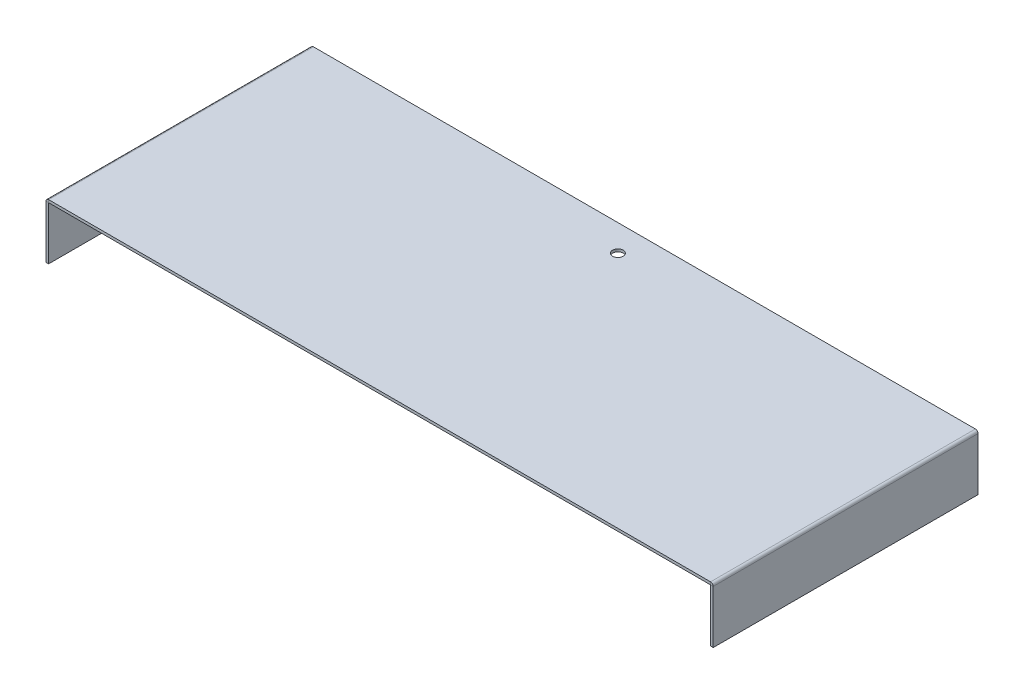
ISO-10303-21;
HEADER;
FILE_DESCRIPTION(('STEP AP214'),'2;1');
FILE_NAME('part.step','',(''),(''),'','','');
FILE_SCHEMA(('AUTOMOTIVE_DESIGN { 1 0 10303 214 1 1 1 1 }'));
ENDSEC;
DATA;
#1=APPLICATION_CONTEXT('core data for automotive mechanical design processes');
#2=APPLICATION_PROTOCOL_DEFINITION('international standard','automotive_design',2000,#1);
#3=PRODUCT_CONTEXT('',#1,'mechanical');
#4=PRODUCT('Part','Part','',(#3));
#5=PRODUCT_RELATED_PRODUCT_CATEGORY('part','',(#4));
#6=PRODUCT_DEFINITION_FORMATION('','',#4);
#7=PRODUCT_DEFINITION_CONTEXT('part definition',#1,'design');
#8=PRODUCT_DEFINITION('design','',#6,#7);
#9=PRODUCT_DEFINITION_SHAPE('','',#8);
#10=(LENGTH_UNIT() NAMED_UNIT(*) SI_UNIT(.MILLI.,.METRE.));
#11=(NAMED_UNIT(*) PLANE_ANGLE_UNIT() SI_UNIT($,.RADIAN.));
#12=(NAMED_UNIT(*) SI_UNIT($,.STERADIAN.) SOLID_ANGLE_UNIT());
#13=UNCERTAINTY_MEASURE_WITH_UNIT(LENGTH_MEASURE(1.E-05),#10,'distance_accuracy_value','');
#14=(GEOMETRIC_REPRESENTATION_CONTEXT(3) GLOBAL_UNCERTAINTY_ASSIGNED_CONTEXT((#13)) GLOBAL_UNIT_ASSIGNED_CONTEXT((#10,
#11,#12)) REPRESENTATION_CONTEXT('',''));
#15=CARTESIAN_POINT('',(0.,0.,0.));
#16=DIRECTION('',(0.,0.,1.));
#17=DIRECTION('',(1.,0.,0.));
#18=AXIS2_PLACEMENT_3D('',#15,#16,#17);
#19=CARTESIAN_POINT('',(-125.,-1.83880688453542E-13,0.));
#20=DIRECTION('',(0.,0.,-1.));
#21=DIRECTION('',(-1.,0.,0.));
#22=AXIS2_PLACEMENT_3D('',#19,#20,#21);
#23=PLANE('',#22);
#24=DIRECTION('',(-1.,0.,0.));
#25=VECTOR('',#24,1.);
#26=CARTESIAN_POINT('',(-125.,-1.83880688453542E-13,0.));
#27=LINE('',#26,#25);
#28=CARTESIAN_POINT('',(-125.,-1.83880688453542E-13,0.));
#29=VERTEX_POINT('',#28);
#30=CARTESIAN_POINT('',(-126.,-1.83880688453542E-13,0.));
#31=VERTEX_POINT('',#30);
#32=EDGE_CURVE('E11',#29,#31,#27,.T.);
#33=ORIENTED_EDGE('',*,*,#32,.F.);
#34=DIRECTION('',(0.,-1.,0.));
#35=VECTOR('',#34,1.);
#36=CARTESIAN_POINT('',(-125.,-1.83880688453542E-13,0.));
#37=LINE('',#36,#35);
#38=CARTESIAN_POINT('',(-125.,-20.,0.));
#39=VERTEX_POINT('',#38);
#40=EDGE_CURVE('E160',#29,#39,#37,.T.);
#41=ORIENTED_EDGE('',*,*,#40,.T.);
#42=DIRECTION('',(-1.,0.,0.));
#43=VECTOR('',#42,1.);
#44=CARTESIAN_POINT('',(-125.,-20.,0.));
#45=LINE('',#44,#43);
#46=CARTESIAN_POINT('',(-126.,-20.,0.));
#47=VERTEX_POINT('',#46);
#48=EDGE_CURVE('E157',#39,#47,#45,.T.);
#49=ORIENTED_EDGE('',*,*,#48,.T.);
#50=DIRECTION('',(0.,1.,0.));
#51=VECTOR('',#50,1.);
#52=CARTESIAN_POINT('',(-126.,-1.83880688453542E-13,0.));
#53=LINE('',#52,#51);
#54=EDGE_CURVE('E127',#31,#47,#53,.F.);
#55=ORIENTED_EDGE('',*,*,#54,.F.);
#56=EDGE_LOOP('',(#33,#41,#49,#55));
#57=FACE_BOUND('',#56,.T.);
#58=ADVANCED_FACE('F36',(#57),#23,.T.);
#59=CARTESIAN_POINT('',(-125.,-1.83880688453542E-13,0.));
#60=DIRECTION('',(0.,0.,-1.));
#61=DIRECTION('',(-1.,0.,0.));
#62=AXIS2_PLACEMENT_3D('',#59,#60,#61);
#63=PLANE('',#62);
#64=DIRECTION('',(0.,1.,0.));
#65=VECTOR('',#64,1.);
#66=CARTESIAN_POINT('',(-125.,-1.83880688453542E-13,0.));
#67=LINE('',#66,#65);
#68=CARTESIAN_POINT('',(-125.,0.999999999999816,0.));
#69=VERTEX_POINT('',#68);
#70=EDGE_CURVE('E43',#29,#69,#67,.T.);
#71=ORIENTED_EDGE('',*,*,#70,.F.);
#72=ORIENTED_EDGE('',*,*,#32,.T.);
#73=CARTESIAN_POINT('',(-125.,-1.83880688453542E-13,0.));
#74=DIRECTION('',(0.,0.,1.));
#75=DIRECTION('',(1.,0.,0.));
#76=AXIS2_PLACEMENT_3D('',#73,#74,#75);
#77=CIRCLE('',#76,1.);
#78=EDGE_CURVE('E192',#31,#69,#77,.F.);
#79=ORIENTED_EDGE('',*,*,#78,.T.);
#80=EDGE_LOOP('',(#71,#72,#79));
#81=FACE_BOUND('',#80,.T.);
#82=ADVANCED_FACE('F222',(#81),#63,.T.);
#83=CARTESIAN_POINT('',(-125.,-1.83880688453542E-13,100.));
#84=DIRECTION('',(0.,0.,1.));
#85=DIRECTION('',(1.,0.,0.));
#86=AXIS2_PLACEMENT_3D('',#83,#84,#85);
#87=PLANE('',#86);
#88=DIRECTION('',(0.,1.,0.));
#89=VECTOR('',#88,1.);
#90=CARTESIAN_POINT('',(-125.,-1.83880688453542E-13,100.));
#91=LINE('',#90,#89);
#92=CARTESIAN_POINT('',(-125.,-1.83880688453542E-13,100.));
#93=VERTEX_POINT('',#92);
#94=CARTESIAN_POINT('',(-125.,0.999999999999816,100.));
#95=VERTEX_POINT('',#94);
#96=EDGE_CURVE('E214',#93,#95,#91,.T.);
#97=ORIENTED_EDGE('',*,*,#96,.F.);
#98=DIRECTION('',(-1.,0.,0.));
#99=VECTOR('',#98,1.);
#100=CARTESIAN_POINT('',(-125.,-1.83880688453542E-13,100.));
#101=LINE('',#100,#99);
#102=CARTESIAN_POINT('',(125.,0.,100.));
#103=VERTEX_POINT('',#102);
#104=EDGE_CURVE('E137',#103,#93,#101,.T.);
#105=ORIENTED_EDGE('',*,*,#104,.F.);
#106=DIRECTION('',(0.,1.,0.));
#107=VECTOR('',#106,1.);
#108=CARTESIAN_POINT('',(125.,0.,100.));
#109=LINE('',#108,#107);
#110=CARTESIAN_POINT('',(125.,1.,100.));
#111=VERTEX_POINT('',#110);
#112=EDGE_CURVE('E206',#103,#111,#109,.T.);
#113=ORIENTED_EDGE('',*,*,#112,.T.);
#114=DIRECTION('',(-1.,0.,0.));
#115=VECTOR('',#114,1.);
#116=CARTESIAN_POINT('',(-125.,0.999999999999816,100.));
#117=LINE('',#116,#115);
#118=EDGE_CURVE('E152',#111,#95,#117,.T.);
#119=ORIENTED_EDGE('',*,*,#118,.T.);
#120=EDGE_LOOP('',(#97,#105,#113,#119));
#121=FACE_BOUND('',#120,.T.);
#122=ADVANCED_FACE('F236',(#121),#87,.T.);
#123=CARTESIAN_POINT('',(-125.,-1.83880688453542E-13,100.));
#124=DIRECTION('',(0.,0.,1.));
#125=DIRECTION('',(1.,0.,0.));
#126=AXIS2_PLACEMENT_3D('',#123,#124,#125);
#127=PLANE('',#126);
#128=DIRECTION('',(-1.,0.,0.));
#129=VECTOR('',#128,1.);
#130=CARTESIAN_POINT('',(-125.,-1.83880688453542E-13,100.));
#131=LINE('',#130,#129);
#132=CARTESIAN_POINT('',(-126.,-1.83880688453542E-13,100.));
#133=VERTEX_POINT('',#132);
#134=EDGE_CURVE('E50',#93,#133,#131,.T.);
#135=ORIENTED_EDGE('',*,*,#134,.F.);
#136=ORIENTED_EDGE('',*,*,#96,.T.);
#137=CARTESIAN_POINT('',(-125.,-1.83880688453542E-13,100.));
#138=DIRECTION('',(0.,0.,1.));
#139=DIRECTION('',(1.,0.,0.));
#140=AXIS2_PLACEMENT_3D('',#137,#138,#139);
#141=CIRCLE('',#140,1.);
#142=EDGE_CURVE('E200',#95,#133,#141,.T.);
#143=ORIENTED_EDGE('',*,*,#142,.T.);
#144=EDGE_LOOP('',(#135,#136,#143));
#145=FACE_BOUND('',#144,.T.);
#146=ADVANCED_FACE('F232',(#145),#127,.T.);
#147=CARTESIAN_POINT('',(125.,0.,0.));
#148=DIRECTION('',(0.,0.,-1.));
#149=DIRECTION('',(-1.,0.,0.));
#150=AXIS2_PLACEMENT_3D('',#147,#148,#149);
#151=PLANE('',#150);
#152=DIRECTION('',(0.,1.,0.));
#153=VECTOR('',#152,1.);
#154=CARTESIAN_POINT('',(125.,0.,0.));
#155=LINE('',#154,#153);
#156=CARTESIAN_POINT('',(125.,0.,0.));
#157=VERTEX_POINT('',#156);
#158=CARTESIAN_POINT('',(125.,1.,0.));
#159=VERTEX_POINT('',#158);
#160=EDGE_CURVE('E211',#157,#159,#155,.T.);
#161=ORIENTED_EDGE('',*,*,#160,.F.);
#162=DIRECTION('',(-1.,0.,0.));
#163=VECTOR('',#162,1.);
#164=CARTESIAN_POINT('',(-125.,-1.83880688453542E-13,0.));
#165=LINE('',#164,#163);
#166=EDGE_CURVE('E163',#157,#29,#165,.T.);
#167=ORIENTED_EDGE('',*,*,#166,.T.);
#168=ORIENTED_EDGE('',*,*,#70,.T.);
#169=DIRECTION('',(-1.,0.,0.));
#170=VECTOR('',#169,1.);
#171=CARTESIAN_POINT('',(-125.,0.999999999999816,0.));
#172=LINE('',#171,#170);
#173=EDGE_CURVE('E121',#159,#69,#172,.T.);
#174=ORIENTED_EDGE('',*,*,#173,.F.);
#175=EDGE_LOOP('',(#161,#167,#168,#174));
#176=FACE_BOUND('',#175,.T.);
#177=ADVANCED_FACE('F218',(#176),#151,.T.);
#178=CARTESIAN_POINT('',(125.,0.,0.));
#179=DIRECTION('',(0.,0.,-1.));
#180=DIRECTION('',(-1.,0.,0.));
#181=AXIS2_PLACEMENT_3D('',#178,#179,#180);
#182=PLANE('',#181);
#183=DIRECTION('',(1.,0.,0.));
#184=VECTOR('',#183,1.);
#185=CARTESIAN_POINT('',(125.,0.,0.));
#186=LINE('',#185,#184);
#187=CARTESIAN_POINT('',(126.,0.,0.));
#188=VERTEX_POINT('',#187);
#189=EDGE_CURVE('E209',#157,#188,#186,.T.);
#190=ORIENTED_EDGE('',*,*,#189,.F.);
#191=ORIENTED_EDGE('',*,*,#160,.T.);
#192=CARTESIAN_POINT('',(125.,0.,0.));
#193=DIRECTION('',(0.,0.,1.));
#194=DIRECTION('',(1.,0.,0.));
#195=AXIS2_PLACEMENT_3D('',#192,#193,#194);
#196=CIRCLE('',#195,1.);
#197=EDGE_CURVE('E195',#159,#188,#196,.F.);
#198=ORIENTED_EDGE('',*,*,#197,.T.);
#199=EDGE_LOOP('',(#190,#191,#198));
#200=FACE_BOUND('',#199,.T.);
#201=ADVANCED_FACE('F244',(#200),#182,.T.);
#202=CARTESIAN_POINT('',(125.,0.,100.));
#203=DIRECTION('',(0.,0.,1.));
#204=DIRECTION('',(1.,0.,0.));
#205=AXIS2_PLACEMENT_3D('',#202,#203,#204);
#206=PLANE('',#205);
#207=DIRECTION('',(1.,0.,0.));
#208=VECTOR('',#207,1.);
#209=CARTESIAN_POINT('',(125.,0.,100.));
#210=LINE('',#209,#208);
#211=CARTESIAN_POINT('',(126.,0.,100.));
#212=VERTEX_POINT('',#211);
#213=EDGE_CURVE('E58',#103,#212,#210,.T.);
#214=ORIENTED_EDGE('',*,*,#213,.F.);
#215=DIRECTION('',(0.,1.,0.));
#216=VECTOR('',#215,1.);
#217=CARTESIAN_POINT('',(125.,0.,100.));
#218=LINE('',#217,#216);
#219=CARTESIAN_POINT('',(125.,-20.,100.));
#220=VERTEX_POINT('',#219);
#221=EDGE_CURVE('E143',#220,#103,#218,.T.);
#222=ORIENTED_EDGE('',*,*,#221,.F.);
#223=DIRECTION('',(-1.,0.,0.));
#224=VECTOR('',#223,1.);
#225=CARTESIAN_POINT('',(126.,-20.,100.));
#226=LINE('',#225,#224);
#227=CARTESIAN_POINT('',(126.,-20.,100.));
#228=VERTEX_POINT('',#227);
#229=EDGE_CURVE('E146',#228,#220,#226,.T.);
#230=ORIENTED_EDGE('',*,*,#229,.F.);
#231=DIRECTION('',(0.,1.,0.));
#232=VECTOR('',#231,1.);
#233=CARTESIAN_POINT('',(126.,0.,100.));
#234=LINE('',#233,#232);
#235=EDGE_CURVE('E149',#228,#212,#234,.T.);
#236=ORIENTED_EDGE('',*,*,#235,.T.);
#237=EDGE_LOOP('',(#214,#222,#230,#236));
#238=FACE_BOUND('',#237,.T.);
#239=ADVANCED_FACE('F281',(#238),#206,.T.);
#240=CARTESIAN_POINT('',(125.,0.,100.));
#241=DIRECTION('',(0.,0.,1.));
#242=DIRECTION('',(1.,0.,0.));
#243=AXIS2_PLACEMENT_3D('',#240,#241,#242);
#244=PLANE('',#243);
#245=ORIENTED_EDGE('',*,*,#112,.F.);
#246=ORIENTED_EDGE('',*,*,#213,.T.);
#247=CARTESIAN_POINT('',(125.,0.,100.));
#248=DIRECTION('',(0.,0.,1.));
#249=DIRECTION('',(1.,0.,0.));
#250=AXIS2_PLACEMENT_3D('',#247,#248,#249);
#251=CIRCLE('',#250,1.);
#252=EDGE_CURVE('E202',#212,#111,#251,.T.);
#253=ORIENTED_EDGE('',*,*,#252,.T.);
#254=EDGE_LOOP('',(#245,#246,#253));
#255=FACE_BOUND('',#254,.T.);
#256=ADVANCED_FACE('F284',(#255),#244,.T.);
#257=CARTESIAN_POINT('',(-126.,-1.83880688453542E-13,100.));
#258=DIRECTION('',(1.,0.,0.));
#259=DIRECTION('',(0.,0.,-1.));
#260=AXIS2_PLACEMENT_3D('',#257,#258,#259);
#261=PLANE('',#260);
#262=DIRECTION('',(0.,1.,0.));
#263=VECTOR('',#262,1.);
#264=CARTESIAN_POINT('',(-126.,-1.83880688453542E-13,100.));
#265=LINE('',#264,#263);
#266=CARTESIAN_POINT('',(-126.,-20.,100.));
#267=VERTEX_POINT('',#266);
#268=EDGE_CURVE('E112',#133,#267,#265,.F.);
#269=ORIENTED_EDGE('',*,*,#268,.F.);
#270=DIRECTION('',(0.,0.,-1.));
#271=VECTOR('',#270,1.);
#272=CARTESIAN_POINT('',(-126.,-1.83880688453542E-13,100.));
#273=LINE('',#272,#271);
#274=EDGE_CURVE('E204',#133,#31,#273,.T.);
#275=ORIENTED_EDGE('',*,*,#274,.T.);
#276=ORIENTED_EDGE('',*,*,#54,.T.);
#277=DIRECTION('',(0.,0.,-1.));
#278=VECTOR('',#277,1.);
#279=CARTESIAN_POINT('',(-126.,-20.,100.));
#280=LINE('',#279,#278);
#281=EDGE_CURVE('E124',#267,#47,#280,.T.);
#282=ORIENTED_EDGE('',*,*,#281,.F.);
#283=EDGE_LOOP('',(#269,#275,#276,#282));
#284=FACE_BOUND('',#283,.T.);
#285=ADVANCED_FACE('F125',(#284),#261,.F.);
#286=CARTESIAN_POINT('',(-125.,-20.,100.));
#287=DIRECTION('',(0.,-1.,0.));
#288=DIRECTION('',(0.,0.,-1.));
#289=AXIS2_PLACEMENT_3D('',#286,#287,#288);
#290=PLANE('',#289);
#291=ORIENTED_EDGE('',*,*,#48,.F.);
#292=DIRECTION('',(0.,0.,-1.));
#293=VECTOR('',#292,1.);
#294=CARTESIAN_POINT('',(-125.,-20.,100.));
#295=LINE('',#294,#293);
#296=CARTESIAN_POINT('',(-125.,-20.,100.));
#297=VERTEX_POINT('',#296);
#298=EDGE_CURVE('E132',#297,#39,#295,.T.);
#299=ORIENTED_EDGE('',*,*,#298,.F.);
#300=DIRECTION('',(-1.,0.,0.));
#301=VECTOR('',#300,1.);
#302=CARTESIAN_POINT('',(-125.,-20.,100.));
#303=LINE('',#302,#301);
#304=EDGE_CURVE('E116',#297,#267,#303,.T.);
#305=ORIENTED_EDGE('',*,*,#304,.T.);
#306=ORIENTED_EDGE('',*,*,#281,.T.);
#307=EDGE_LOOP('',(#291,#299,#305,#306));
#308=FACE_BOUND('',#307,.T.);
#309=ADVANCED_FACE('F134',(#308),#290,.T.);
#310=CARTESIAN_POINT('',(-125.,-1.83880688453542E-13,100.));
#311=DIRECTION('',(1.,0.,0.));
#312=DIRECTION('',(0.,0.,-1.));
#313=AXIS2_PLACEMENT_3D('',#310,#311,#312);
#314=PLANE('',#313);
#315=ORIENTED_EDGE('',*,*,#40,.F.);
#316=DIRECTION('',(0.,0.,-1.));
#317=VECTOR('',#316,1.);
#318=CARTESIAN_POINT('',(-125.,-1.83880688453542E-13,100.));
#319=LINE('',#318,#317);
#320=EDGE_CURVE('E183',#93,#29,#319,.T.);
#321=ORIENTED_EDGE('',*,*,#320,.F.);
#322=DIRECTION('',(0.,-1.,0.));
#323=VECTOR('',#322,1.);
#324=CARTESIAN_POINT('',(-125.,-1.83880688453542E-13,100.));
#325=LINE('',#324,#323);
#326=EDGE_CURVE('E135',#93,#297,#325,.T.);
#327=ORIENTED_EDGE('',*,*,#326,.T.);
#328=ORIENTED_EDGE('',*,*,#298,.T.);
#329=EDGE_LOOP('',(#315,#321,#327,#328));
#330=FACE_BOUND('',#329,.T.);
#331=ADVANCED_FACE('F264',(#330),#314,.T.);
#332=CARTESIAN_POINT('',(-125.,-1.83880688453542E-13,100.));
#333=DIRECTION('',(0.,-1.,0.));
#334=DIRECTION('',(1.,0.,0.));
#335=AXIS2_PLACEMENT_3D('',#332,#333,#334);
#336=PLANE('',#335);
#337=CARTESIAN_POINT('',(0.,0.,10.));
#338=DIRECTION('',(0.,-1.,0.));
#339=DIRECTION('',(1.,0.,0.));
#340=AXIS2_PLACEMENT_3D('',#337,#338,#339);
#341=CIRCLE('',#340,2.);
#342=CARTESIAN_POINT('',(-2.,0.,10.));
#343=VERTEX_POINT('',#342);
#344=EDGE_CURVE('E158',#343,#343,#341,.T.);
#345=ORIENTED_EDGE('',*,*,#344,.F.);
#346=EDGE_LOOP('',(#345));
#347=FACE_BOUND('',#346,.T.);
#348=ORIENTED_EDGE('',*,*,#166,.F.);
#349=DIRECTION('',(0.,0.,-1.));
#350=VECTOR('',#349,1.);
#351=CARTESIAN_POINT('',(125.,0.,100.));
#352=LINE('',#351,#350);
#353=EDGE_CURVE('E180',#103,#157,#352,.T.);
#354=ORIENTED_EDGE('',*,*,#353,.F.);
#355=ORIENTED_EDGE('',*,*,#104,.T.);
#356=ORIENTED_EDGE('',*,*,#320,.T.);
#357=EDGE_LOOP('',(#348,#354,#355,#356));
#358=FACE_BOUND('',#357,.T.);
#359=ADVANCED_FACE('F261',(#347,#358),#336,.T.);
#360=CARTESIAN_POINT('',(125.,0.,100.));
#361=DIRECTION('',(-1.,0.,0.));
#362=DIRECTION('',(0.,0.,1.));
#363=AXIS2_PLACEMENT_3D('',#360,#361,#362);
#364=PLANE('',#363);
#365=DIRECTION('',(0.,1.,0.));
#366=VECTOR('',#365,1.);
#367=CARTESIAN_POINT('',(125.,0.,0.));
#368=LINE('',#367,#366);
#369=CARTESIAN_POINT('',(125.,-20.,0.));
#370=VERTEX_POINT('',#369);
#371=EDGE_CURVE('E166',#370,#157,#368,.T.);
#372=ORIENTED_EDGE('',*,*,#371,.F.);
#373=DIRECTION('',(0.,0.,-1.));
#374=VECTOR('',#373,1.);
#375=CARTESIAN_POINT('',(125.,-20.,100.));
#376=LINE('',#375,#374);
#377=EDGE_CURVE('E178',#220,#370,#376,.T.);
#378=ORIENTED_EDGE('',*,*,#377,.F.);
#379=ORIENTED_EDGE('',*,*,#221,.T.);
#380=ORIENTED_EDGE('',*,*,#353,.T.);
#381=EDGE_LOOP('',(#372,#378,#379,#380));
#382=FACE_BOUND('',#381,.T.);
#383=ADVANCED_FACE('F258',(#382),#364,.T.);
#384=CARTESIAN_POINT('',(126.,-20.,100.));
#385=DIRECTION('',(0.,-1.,0.));
#386=DIRECTION('',(0.,0.,-1.));
#387=AXIS2_PLACEMENT_3D('',#384,#385,#386);
#388=PLANE('',#387);
#389=DIRECTION('',(-1.,0.,0.));
#390=VECTOR('',#389,1.);
#391=CARTESIAN_POINT('',(126.,-20.,0.));
#392=LINE('',#391,#390);
#393=CARTESIAN_POINT('',(126.,-20.,0.));
#394=VERTEX_POINT('',#393);
#395=EDGE_CURVE('E169',#394,#370,#392,.T.);
#396=ORIENTED_EDGE('',*,*,#395,.F.);
#397=DIRECTION('',(0.,0.,-1.));
#398=VECTOR('',#397,1.);
#399=CARTESIAN_POINT('',(126.,-20.,100.));
#400=LINE('',#399,#398);
#401=EDGE_CURVE('E155',#228,#394,#400,.T.);
#402=ORIENTED_EDGE('',*,*,#401,.F.);
#403=ORIENTED_EDGE('',*,*,#229,.T.);
#404=ORIENTED_EDGE('',*,*,#377,.T.);
#405=EDGE_LOOP('',(#396,#402,#403,#404));
#406=FACE_BOUND('',#405,.T.);
#407=ADVANCED_FACE('F253',(#406),#388,.T.);
#408=CARTESIAN_POINT('',(126.,0.,100.));
#409=DIRECTION('',(-1.,0.,0.));
#410=DIRECTION('',(0.,0.,1.));
#411=AXIS2_PLACEMENT_3D('',#408,#409,#410);
#412=PLANE('',#411);
#413=DIRECTION('',(0.,1.,0.));
#414=VECTOR('',#413,1.);
#415=CARTESIAN_POINT('',(126.,0.,0.));
#416=LINE('',#415,#414);
#417=EDGE_CURVE('E172',#394,#188,#416,.T.);
#418=ORIENTED_EDGE('',*,*,#417,.T.);
#419=DIRECTION('',(0.,0.,-1.));
#420=VECTOR('',#419,1.);
#421=CARTESIAN_POINT('',(126.,0.,100.));
#422=LINE('',#421,#420);
#423=EDGE_CURVE('E198',#188,#212,#422,.F.);
#424=ORIENTED_EDGE('',*,*,#423,.T.);
#425=ORIENTED_EDGE('',*,*,#235,.F.);
#426=ORIENTED_EDGE('',*,*,#401,.T.);
#427=EDGE_LOOP('',(#418,#424,#425,#426));
#428=FACE_BOUND('',#427,.T.);
#429=ADVANCED_FACE('F247',(#428),#412,.F.);
#430=CARTESIAN_POINT('',(-125.,0.999999999999816,100.));
#431=DIRECTION('',(0.,-1.,0.));
#432=DIRECTION('',(1.,0.,0.));
#433=AXIS2_PLACEMENT_3D('',#430,#431,#432);
#434=PLANE('',#433);
#435=CARTESIAN_POINT('',(0.,0.999999999999908,10.));
#436=DIRECTION('',(0.,1.,0.));
#437=DIRECTION('',(-1.,0.,0.));
#438=AXIS2_PLACEMENT_3D('',#435,#436,#437);
#439=CIRCLE('',#438,2.);
#440=CARTESIAN_POINT('',(-2.,0.999999999999907,10.));
#441=VERTEX_POINT('',#440);
#442=EDGE_CURVE('E324',#441,#441,#439,.T.);
#443=ORIENTED_EDGE('',*,*,#442,.F.);
#444=EDGE_LOOP('',(#443));
#445=FACE_BOUND('',#444,.T.);
#446=ORIENTED_EDGE('',*,*,#118,.F.);
#447=DIRECTION('',(0.,0.,-1.));
#448=VECTOR('',#447,1.);
#449=CARTESIAN_POINT('',(125.,1.,100.));
#450=LINE('',#449,#448);
#451=EDGE_CURVE('E189',#111,#159,#450,.T.);
#452=ORIENTED_EDGE('',*,*,#451,.T.);
#453=ORIENTED_EDGE('',*,*,#173,.T.);
#454=DIRECTION('',(0.,0.,-1.));
#455=VECTOR('',#454,1.);
#456=CARTESIAN_POINT('',(-125.,0.999999999999816,100.));
#457=LINE('',#456,#455);
#458=EDGE_CURVE('E131',#69,#95,#457,.F.);
#459=ORIENTED_EDGE('',*,*,#458,.T.);
#460=EDGE_LOOP('',(#446,#452,#453,#459));
#461=FACE_BOUND('',#460,.T.);
#462=ADVANCED_FACE('F227',(#445,#461),#434,.F.);
#463=CARTESIAN_POINT('',(0.,0.,100.));
#464=DIRECTION('',(0.,0.,1.));
#465=DIRECTION('',(1.,0.,0.));
#466=AXIS2_PLACEMENT_3D('',#463,#464,#465);
#467=PLANE('',#466);
#468=ORIENTED_EDGE('',*,*,#326,.F.);
#469=ORIENTED_EDGE('',*,*,#134,.T.);
#470=ORIENTED_EDGE('',*,*,#268,.T.);
#471=ORIENTED_EDGE('',*,*,#304,.F.);
#472=EDGE_LOOP('',(#468,#469,#470,#471));
#473=FACE_BOUND('',#472,.T.);
#474=ADVANCED_FACE('F114',(#473),#467,.T.);
#475=CARTESIAN_POINT('',(0.,0.,0.));
#476=DIRECTION('',(0.,0.,1.));
#477=DIRECTION('',(1.,0.,0.));
#478=AXIS2_PLACEMENT_3D('',#475,#476,#477);
#479=PLANE('',#478);
#480=ORIENTED_EDGE('',*,*,#371,.T.);
#481=ORIENTED_EDGE('',*,*,#189,.T.);
#482=ORIENTED_EDGE('',*,*,#417,.F.);
#483=ORIENTED_EDGE('',*,*,#395,.T.);
#484=EDGE_LOOP('',(#480,#481,#482,#483));
#485=FACE_BOUND('',#484,.T.);
#486=ADVANCED_FACE('F251',(#485),#479,.F.);
#487=CARTESIAN_POINT('',(125.,0.,100.));
#488=DIRECTION('',(0.,0.,-1.));
#489=DIRECTION('',(-1.,0.,0.));
#490=AXIS2_PLACEMENT_3D('',#487,#488,#489);
#491=CYLINDRICAL_SURFACE('',#490,1.);
#492=ORIENTED_EDGE('',*,*,#252,.F.);
#493=ORIENTED_EDGE('',*,*,#423,.F.);
#494=ORIENTED_EDGE('',*,*,#197,.F.);
#495=ORIENTED_EDGE('',*,*,#451,.F.);
#496=EDGE_LOOP('',(#492,#493,#494,#495));
#497=FACE_BOUND('',#496,.T.);
#498=ADVANCED_FACE('F240',(#497),#491,.T.);
#499=CARTESIAN_POINT('',(-125.,-1.83880688453542E-13,100.));
#500=DIRECTION('',(0.,0.,-1.));
#501=DIRECTION('',(-1.,0.,0.));
#502=AXIS2_PLACEMENT_3D('',#499,#500,#501);
#503=CYLINDRICAL_SURFACE('',#502,1.);
#504=ORIENTED_EDGE('',*,*,#142,.F.);
#505=ORIENTED_EDGE('',*,*,#458,.F.);
#506=ORIENTED_EDGE('',*,*,#78,.F.);
#507=ORIENTED_EDGE('',*,*,#274,.F.);
#508=EDGE_LOOP('',(#504,#505,#506,#507));
#509=FACE_BOUND('',#508,.T.);
#510=ADVANCED_FACE('F230',(#509),#503,.T.);
#511=CARTESIAN_POINT('',(0.,-20.0000000000001,10.));
#512=DIRECTION('',(0.,1.,0.));
#513=DIRECTION('',(-1.,0.,0.));
#514=AXIS2_PLACEMENT_3D('',#511,#512,#513);
#515=CYLINDRICAL_SURFACE('',#514,2.);
#516=CARTESIAN_POINT('',(-2.,0.,10.));
#517=CARTESIAN_POINT('',(-2.,0.010416666666573,10.));
#518=CARTESIAN_POINT('',(-2.,0.0208333333332397,10.));
#519=CARTESIAN_POINT('',(-2.,0.041666666666573,10.));
#520=CARTESIAN_POINT('',(-2.,0.0520833333332397,10.));
#521=CARTESIAN_POINT('',(-2.,0.0729166666665731,10.));
#522=CARTESIAN_POINT('',(-2.,0.0833333333332397,10.));
#523=CARTESIAN_POINT('',(-2.,0.104166666666573,10.));
#524=CARTESIAN_POINT('',(-2.,0.11458333333324,10.));
#525=CARTESIAN_POINT('',(-2.,0.135416666666573,10.));
#526=CARTESIAN_POINT('',(-2.,0.14583333333324,10.));
#527=CARTESIAN_POINT('',(-2.,0.166666666666573,10.));
#528=CARTESIAN_POINT('',(-2.,0.17708333333324,10.));
#529=CARTESIAN_POINT('',(-2.,0.197916666666573,10.));
#530=CARTESIAN_POINT('',(-2.,0.20833333333324,10.));
#531=CARTESIAN_POINT('',(-2.,0.229166666666573,10.));
#532=CARTESIAN_POINT('',(-2.,0.23958333333324,10.));
#533=CARTESIAN_POINT('',(-2.,0.260416666666573,10.));
#534=CARTESIAN_POINT('',(-2.,0.27083333333324,10.));
#535=CARTESIAN_POINT('',(-2.,0.291666666666573,10.));
#536=CARTESIAN_POINT('',(-2.,0.30208333333324,10.));
#537=CARTESIAN_POINT('',(-2.,0.322916666666573,10.));
#538=CARTESIAN_POINT('',(-2.,0.33333333333324,10.));
#539=CARTESIAN_POINT('',(-2.,0.354166666666573,10.));
#540=CARTESIAN_POINT('',(-2.,0.36458333333324,10.));
#541=CARTESIAN_POINT('',(-2.,0.385416666666573,10.));
#542=CARTESIAN_POINT('',(-2.,0.39583333333324,10.));
#543=CARTESIAN_POINT('',(-2.,0.416666666666573,10.));
#544=CARTESIAN_POINT('',(-2.,0.42708333333324,10.));
#545=CARTESIAN_POINT('',(-2.,0.447916666666573,10.));
#546=CARTESIAN_POINT('',(-2.,0.45833333333324,10.));
#547=CARTESIAN_POINT('',(-2.,0.479166666666573,10.));
#548=CARTESIAN_POINT('',(-2.,0.48958333333324,10.));
#549=CARTESIAN_POINT('',(-2.,0.510416666666573,10.));
#550=CARTESIAN_POINT('',(-2.,0.52083333333324,10.));
#551=CARTESIAN_POINT('',(-2.,0.541666666666573,10.));
#552=CARTESIAN_POINT('',(-2.,0.55208333333324,10.));
#553=CARTESIAN_POINT('',(-2.,0.572916666666573,10.));
#554=CARTESIAN_POINT('',(-2.,0.58333333333324,10.));
#555=CARTESIAN_POINT('',(-2.,0.604166666666574,10.));
#556=CARTESIAN_POINT('',(-2.,0.61458333333324,10.));
#557=CARTESIAN_POINT('',(-2.,0.635416666666574,10.));
#558=CARTESIAN_POINT('',(-2.,0.64583333333324,10.));
#559=CARTESIAN_POINT('',(-2.,0.666666666666574,10.));
#560=CARTESIAN_POINT('',(-2.,0.67708333333324,10.));
#561=CARTESIAN_POINT('',(-2.,0.697916666666574,10.));
#562=CARTESIAN_POINT('',(-2.,0.70833333333324,10.));
#563=CARTESIAN_POINT('',(-2.,0.729166666666574,10.));
#564=CARTESIAN_POINT('',(-2.,0.73958333333324,10.));
#565=CARTESIAN_POINT('',(-2.,0.760416666666574,10.));
#566=CARTESIAN_POINT('',(-2.,0.77083333333324,10.));
#567=CARTESIAN_POINT('',(-2.,0.791666666666574,10.));
#568=CARTESIAN_POINT('',(-2.,0.80208333333324,10.));
#569=CARTESIAN_POINT('',(-2.,0.822916666666574,10.));
#570=CARTESIAN_POINT('',(-2.,0.83333333333324,10.));
#571=CARTESIAN_POINT('',(-2.,0.854166666666574,10.));
#572=CARTESIAN_POINT('',(-2.,0.86458333333324,10.));
#573=CARTESIAN_POINT('',(-2.,0.885416666666574,10.));
#574=CARTESIAN_POINT('',(-2.,0.89583333333324,10.));
#575=CARTESIAN_POINT('',(-2.,0.916666666666574,10.));
#576=CARTESIAN_POINT('',(-2.,0.92708333333324,10.));
#577=CARTESIAN_POINT('',(-2.,0.947916666666574,10.));
#578=CARTESIAN_POINT('',(-2.,0.95833333333324,10.));
#579=CARTESIAN_POINT('',(-2.,0.979166666666574,10.));
#580=CARTESIAN_POINT('',(-2.,0.989583333333241,10.));
#581=CARTESIAN_POINT('',(-2.,0.999999999999907,10.));
#582=B_SPLINE_CURVE_WITH_KNOTS('',3,(#516,#517,#518,#519,#520,#521,#522,#523,#524,#525,#526,
#527,#528,#529,#530,#531,#532,#533,#534,#535,#536,#537,#538,#539,#540,#541,#542,#543,#544,#545,
#546,#547,#548,#549,#550,#551,#552,#553,#554,#555,#556,#557,#558,#559,#560,#561,#562,#563,#564,
#565,#566,#567,#568,#569,#570,#571,#572,#573,#574,#575,#576,#577,#578,#579,#580,#581),
.UNSPECIFIED.,.F.,.F.,(4,2,2,2,2,2,2,2,2,2,2,2,2,2,2,2,2,2,2,2,2,2,2,2,2,2,2,2,2,2,2,2,4),(0.,
0.03125,0.0625000000000001,0.0937500000000001,0.125,0.15625,0.1875,0.21875,0.25,0.28125,0.3125,
0.34375,0.375,0.40625,0.4375,0.46875,0.5,0.53125,0.5625,0.593750000000001,0.625000000000001,
0.656250000000001,0.687500000000001,0.718750000000001,0.750000000000001,0.781250000000001,
0.812500000000001,0.843750000000001,0.875000000000001,0.906250000000001,0.937500000000001,
0.968750000000001,1.),.UNSPECIFIED.);
#583=EDGE_CURVE('BSEAM290',#343,#441,#582,.T.);
#584=ORIENTED_EDGE('',*,*,#344,.T.);
#585=ORIENTED_EDGE('',*,*,#442,.T.);
#586=ORIENTED_EDGE('',*,*,#583,.T.);
#587=ORIENTED_EDGE('',*,*,#583,.F.);
#588=EDGE_LOOP('',(#584,#586,#585,#587));
#589=FACE_BOUND('',#588,.T.);
#590=ADVANCED_FACE('F290',(#589),#515,.F.);
#591=CLOSED_SHELL('',(#58,#82,#122,#146,#177,#201,#239,#256,#285,#309,#331,#359,#383,#407,#429,
#462,#474,#486,#498,#510,#590));
#592=MANIFOLD_SOLID_BREP('B2',#591);
#593=ADVANCED_BREP_SHAPE_REPRESENTATION('',(#18,#592),#14);
#594=SHAPE_DEFINITION_REPRESENTATION(#9,#593);
ENDSEC;
END-ISO-10303-21;
